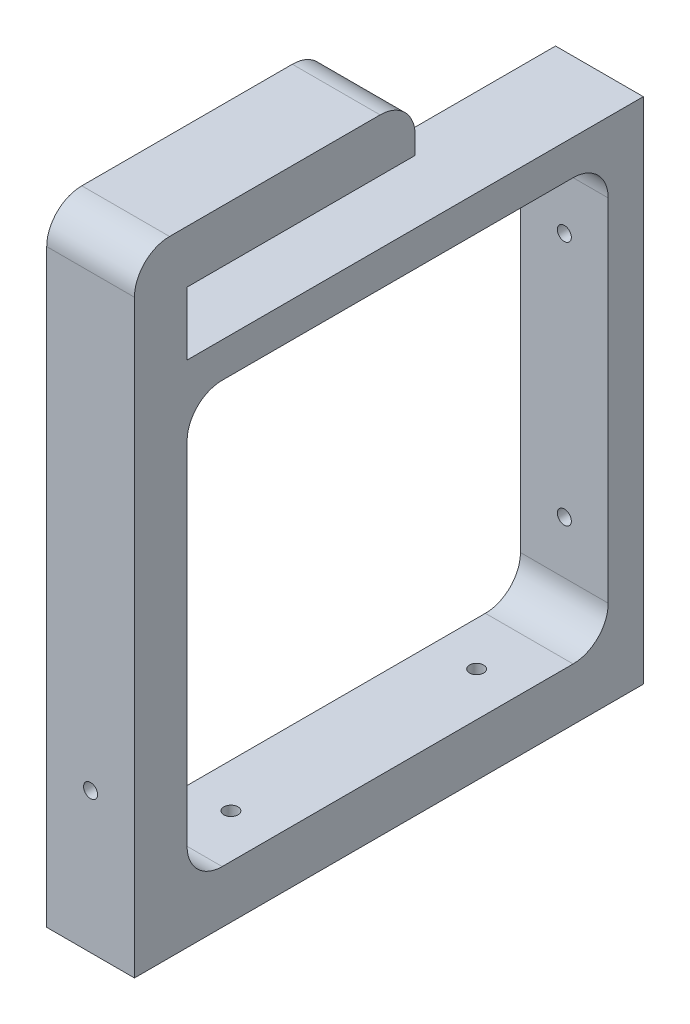
ISO-10303-21;
HEADER;
FILE_DESCRIPTION(('STEP AP214'),'2;1');
FILE_NAME('part.step','',(''),(''),'','','');
FILE_SCHEMA(('AUTOMOTIVE_DESIGN { 1 0 10303 214 1 1 1 1 }'));
ENDSEC;
DATA;
#1=APPLICATION_CONTEXT('core data for automotive mechanical design processes');
#2=APPLICATION_PROTOCOL_DEFINITION('international standard','automotive_design',2000,#1);
#3=PRODUCT_CONTEXT('',#1,'mechanical');
#4=PRODUCT('Part','Part','',(#3));
#5=PRODUCT_RELATED_PRODUCT_CATEGORY('part','',(#4));
#6=PRODUCT_DEFINITION_FORMATION('','',#4);
#7=PRODUCT_DEFINITION_CONTEXT('part definition',#1,'design');
#8=PRODUCT_DEFINITION('design','',#6,#7);
#9=PRODUCT_DEFINITION_SHAPE('','',#8);
#10=(LENGTH_UNIT() NAMED_UNIT(*) SI_UNIT(.MILLI.,.METRE.));
#11=(NAMED_UNIT(*) PLANE_ANGLE_UNIT() SI_UNIT($,.RADIAN.));
#12=(NAMED_UNIT(*) SI_UNIT($,.STERADIAN.) SOLID_ANGLE_UNIT());
#13=UNCERTAINTY_MEASURE_WITH_UNIT(LENGTH_MEASURE(1.E-05),#10,'distance_accuracy_value','');
#14=(GEOMETRIC_REPRESENTATION_CONTEXT(3) GLOBAL_UNCERTAINTY_ASSIGNED_CONTEXT((#13)) GLOBAL_UNIT_ASSIGNED_CONTEXT((#10,
#11,#12)) REPRESENTATION_CONTEXT('',''));
#15=CARTESIAN_POINT('',(0.,0.,0.));
#16=DIRECTION('',(0.,0.,1.));
#17=DIRECTION('',(1.,0.,0.));
#18=AXIS2_PLACEMENT_3D('',#15,#16,#17);
#19=CARTESIAN_POINT('',(25.,0.,0.));
#20=DIRECTION('',(1.,0.,0.));
#21=DIRECTION('',(0.,0.,-1.));
#22=AXIS2_PLACEMENT_3D('',#19,#20,#21);
#23=PLANE('',#22);
#24=DIRECTION('',(0.,1.,0.));
#25=VECTOR('',#24,1.);
#26=CARTESIAN_POINT('',(25.,163.,-80.));
#27=LINE('',#26,#25);
#28=CARTESIAN_POINT('',(25.,163.,-80.));
#29=VERTEX_POINT('',#28);
#30=CARTESIAN_POINT('',(25.,168.,-80.));
#31=VERTEX_POINT('',#30);
#32=EDGE_CURVE('E279',#29,#31,#27,.T.);
#33=ORIENTED_EDGE('',*,*,#32,.T.);
#34=CARTESIAN_POINT('',(25.,168.,-70.));
#35=DIRECTION('',(1.,0.,0.));
#36=DIRECTION('',(0.,0.,-1.));
#37=AXIS2_PLACEMENT_3D('',#34,#35,#36);
#38=CIRCLE('',#37,10.);
#39=CARTESIAN_POINT('',(25.,178.,-70.));
#40=VERTEX_POINT('',#39);
#41=EDGE_CURVE('E201',#31,#40,#38,.T.);
#42=ORIENTED_EDGE('',*,*,#41,.T.);
#43=DIRECTION('',(0.,0.,1.));
#44=VECTOR('',#43,1.);
#45=CARTESIAN_POINT('',(25.,178.,-80.));
#46=LINE('',#45,#44);
#47=CARTESIAN_POINT('',(25.,178.,-9.99999999999999));
#48=VERTEX_POINT('',#47);
#49=EDGE_CURVE('E281',#40,#48,#46,.T.);
#50=ORIENTED_EDGE('',*,*,#49,.T.);
#51=CARTESIAN_POINT('',(25.,168.,-10.));
#52=DIRECTION('',(1.,0.,0.));
#53=DIRECTION('',(0.,0.,-1.));
#54=AXIS2_PLACEMENT_3D('',#51,#52,#53);
#55=CIRCLE('',#54,10.);
#56=CARTESIAN_POINT('',(25.,168.,0.));
#57=VERTEX_POINT('',#56);
#58=EDGE_CURVE('E164',#48,#57,#55,.T.);
#59=ORIENTED_EDGE('',*,*,#58,.T.);
#60=DIRECTION('',(0.,-1.,0.));
#61=VECTOR('',#60,1.);
#62=CARTESIAN_POINT('',(25.,178.,0.));
#63=LINE('',#62,#61);
#64=CARTESIAN_POINT('',(25.,0.,0.));
#65=VERTEX_POINT('',#64);
#66=EDGE_CURVE('E157',#57,#65,#63,.T.);
#67=ORIENTED_EDGE('',*,*,#66,.T.);
#68=DIRECTION('',(0.,0.,-1.));
#69=VECTOR('',#68,1.);
#70=CARTESIAN_POINT('',(25.,0.,0.));
#71=LINE('',#70,#69);
#72=CARTESIAN_POINT('',(25.,0.,-145.));
#73=VERTEX_POINT('',#72);
#74=EDGE_CURVE('E160',#65,#73,#71,.T.);
#75=ORIENTED_EDGE('',*,*,#74,.T.);
#76=DIRECTION('',(0.,1.,0.));
#77=VECTOR('',#76,1.);
#78=CARTESIAN_POINT('',(25.,0.,-145.));
#79=LINE('',#78,#77);
#80=CARTESIAN_POINT('',(25.,145.,-145.));
#81=VERTEX_POINT('',#80);
#82=EDGE_CURVE('E178',#73,#81,#79,.T.);
#83=ORIENTED_EDGE('',*,*,#82,.T.);
#84=DIRECTION('',(0.,0.,1.));
#85=VECTOR('',#84,1.);
#86=CARTESIAN_POINT('',(25.,145.,-145.));
#87=LINE('',#86,#85);
#88=CARTESIAN_POINT('',(25.,145.,-15.));
#89=VERTEX_POINT('',#88);
#90=EDGE_CURVE('E273',#81,#89,#87,.T.);
#91=ORIENTED_EDGE('',*,*,#90,.T.);
#92=DIRECTION('',(0.,1.,0.));
#93=VECTOR('',#92,1.);
#94=CARTESIAN_POINT('',(25.,145.,-15.));
#95=LINE('',#94,#93);
#96=CARTESIAN_POINT('',(25.,163.,-15.));
#97=VERTEX_POINT('',#96);
#98=EDGE_CURVE('E275',#89,#97,#95,.T.);
#99=ORIENTED_EDGE('',*,*,#98,.T.);
#100=DIRECTION('',(0.,0.,-1.));
#101=VECTOR('',#100,1.);
#102=CARTESIAN_POINT('',(25.,163.,-15.));
#103=LINE('',#102,#101);
#104=EDGE_CURVE('E277',#97,#29,#103,.T.);
#105=ORIENTED_EDGE('',*,*,#104,.T.);
#106=EDGE_LOOP('',(#33,#42,#50,#59,#67,#75,#83,#91,#99,#105));
#107=FACE_BOUND('',#106,.T.);
#108=DIRECTION('',(0.,-1.,0.));
#109=VECTOR('',#108,1.);
#110=CARTESIAN_POINT('',(25.,135.,-15.));
#111=LINE('',#110,#109);
#112=CARTESIAN_POINT('',(25.,125.,-15.));
#113=VERTEX_POINT('',#112);
#114=CARTESIAN_POINT('',(25.,25.,-15.));
#115=VERTEX_POINT('',#114);
#116=EDGE_CURVE('E253',#113,#115,#111,.T.);
#117=ORIENTED_EDGE('',*,*,#116,.F.);
#118=CARTESIAN_POINT('',(25.,125.,-25.));
#119=DIRECTION('',(1.,0.,0.));
#120=DIRECTION('',(0.,0.,-1.));
#121=AXIS2_PLACEMENT_3D('',#118,#119,#120);
#122=CIRCLE('',#121,10.);
#123=CARTESIAN_POINT('',(25.,135.,-25.));
#124=VERTEX_POINT('',#123);
#125=EDGE_CURVE('E234',#113,#124,#122,.F.);
#126=ORIENTED_EDGE('',*,*,#125,.T.);
#127=DIRECTION('',(0.,0.,1.));
#128=VECTOR('',#127,1.);
#129=CARTESIAN_POINT('',(25.,135.,-135.));
#130=LINE('',#129,#128);
#131=CARTESIAN_POINT('',(25.,135.,-125.));
#132=VERTEX_POINT('',#131);
#133=EDGE_CURVE('E256',#132,#124,#130,.T.);
#134=ORIENTED_EDGE('',*,*,#133,.F.);
#135=CARTESIAN_POINT('',(25.,125.,-125.));
#136=DIRECTION('',(1.,0.,0.));
#137=DIRECTION('',(0.,0.,-1.));
#138=AXIS2_PLACEMENT_3D('',#135,#136,#137);
#139=CIRCLE('',#138,10.);
#140=CARTESIAN_POINT('',(25.,125.,-135.));
#141=VERTEX_POINT('',#140);
#142=EDGE_CURVE('E230',#132,#141,#139,.F.);
#143=ORIENTED_EDGE('',*,*,#142,.T.);
#144=DIRECTION('',(0.,1.,0.));
#145=VECTOR('',#144,1.);
#146=CARTESIAN_POINT('',(25.,15.,-135.));
#147=LINE('',#146,#145);
#148=CARTESIAN_POINT('',(25.,25.,-135.));
#149=VERTEX_POINT('',#148);
#150=EDGE_CURVE('E258',#149,#141,#147,.T.);
#151=ORIENTED_EDGE('',*,*,#150,.F.);
#152=CARTESIAN_POINT('',(25.,25.,-125.));
#153=DIRECTION('',(1.,0.,0.));
#154=DIRECTION('',(0.,0.,-1.));
#155=AXIS2_PLACEMENT_3D('',#152,#153,#154);
#156=CIRCLE('',#155,10.);
#157=CARTESIAN_POINT('',(25.,15.,-125.));
#158=VERTEX_POINT('',#157);
#159=EDGE_CURVE('E226',#149,#158,#156,.F.);
#160=ORIENTED_EDGE('',*,*,#159,.T.);
#161=DIRECTION('',(0.,0.,-1.));
#162=VECTOR('',#161,1.);
#163=CARTESIAN_POINT('',(25.,15.,-15.));
#164=LINE('',#163,#162);
#165=CARTESIAN_POINT('',(25.,15.,-25.));
#166=VERTEX_POINT('',#165);
#167=EDGE_CURVE('E255',#166,#158,#164,.T.);
#168=ORIENTED_EDGE('',*,*,#167,.F.);
#169=CARTESIAN_POINT('',(25.,25.,-25.));
#170=DIRECTION('',(1.,0.,0.));
#171=DIRECTION('',(0.,0.,-1.));
#172=AXIS2_PLACEMENT_3D('',#169,#170,#171);
#173=CIRCLE('',#172,10.);
#174=EDGE_CURVE('E11',#166,#115,#173,.F.);
#175=ORIENTED_EDGE('',*,*,#174,.T.);
#176=EDGE_LOOP('',(#117,#126,#134,#143,#151,#160,#168,#175));
#177=FACE_BOUND('',#176,.T.);
#178=ADVANCED_FACE('F33',(#107,#177),#23,.T.);
#179=CARTESIAN_POINT('',(0.,0.,0.));
#180=DIRECTION('',(1.,0.,0.));
#181=DIRECTION('',(0.,0.,-1.));
#182=AXIS2_PLACEMENT_3D('',#179,#180,#181);
#183=PLANE('',#182);
#184=DIRECTION('',(0.,0.,1.));
#185=VECTOR('',#184,1.);
#186=CARTESIAN_POINT('',(0.,178.,-80.));
#187=LINE('',#186,#185);
#188=CARTESIAN_POINT('',(0.,178.,-70.));
#189=VERTEX_POINT('',#188);
#190=CARTESIAN_POINT('',(0.,178.,-9.99999999999999));
#191=VERTEX_POINT('',#190);
#192=EDGE_CURVE('E169',#189,#191,#187,.T.);
#193=ORIENTED_EDGE('',*,*,#192,.F.);
#194=CARTESIAN_POINT('',(0.,168.,-70.));
#195=DIRECTION('',(1.,0.,0.));
#196=DIRECTION('',(0.,0.,-1.));
#197=AXIS2_PLACEMENT_3D('',#194,#195,#196);
#198=CIRCLE('',#197,10.);
#199=CARTESIAN_POINT('',(0.,168.,-80.));
#200=VERTEX_POINT('',#199);
#201=EDGE_CURVE('E196',#189,#200,#198,.F.);
#202=ORIENTED_EDGE('',*,*,#201,.T.);
#203=DIRECTION('',(0.,1.,0.));
#204=VECTOR('',#203,1.);
#205=CARTESIAN_POINT('',(0.,163.,-80.));
#206=LINE('',#205,#204);
#207=CARTESIAN_POINT('',(0.,163.,-80.));
#208=VERTEX_POINT('',#207);
#209=EDGE_CURVE('E295',#208,#200,#206,.T.);
#210=ORIENTED_EDGE('',*,*,#209,.F.);
#211=DIRECTION('',(0.,0.,-1.));
#212=VECTOR('',#211,1.);
#213=CARTESIAN_POINT('',(0.,163.,-15.));
#214=LINE('',#213,#212);
#215=CARTESIAN_POINT('',(0.,163.,-15.));
#216=VERTEX_POINT('',#215);
#217=EDGE_CURVE('E293',#216,#208,#214,.T.);
#218=ORIENTED_EDGE('',*,*,#217,.F.);
#219=DIRECTION('',(0.,1.,0.));
#220=VECTOR('',#219,1.);
#221=CARTESIAN_POINT('',(0.,145.,-15.));
#222=LINE('',#221,#220);
#223=CARTESIAN_POINT('',(0.,145.,-15.));
#224=VERTEX_POINT('',#223);
#225=EDGE_CURVE('E291',#224,#216,#222,.T.);
#226=ORIENTED_EDGE('',*,*,#225,.F.);
#227=DIRECTION('',(0.,0.,1.));
#228=VECTOR('',#227,1.);
#229=CARTESIAN_POINT('',(0.,145.,-145.));
#230=LINE('',#229,#228);
#231=CARTESIAN_POINT('',(0.,145.,-145.));
#232=VERTEX_POINT('',#231);
#233=EDGE_CURVE('E289',#232,#224,#230,.T.);
#234=ORIENTED_EDGE('',*,*,#233,.F.);
#235=DIRECTION('',(0.,1.,0.));
#236=VECTOR('',#235,1.);
#237=CARTESIAN_POINT('',(0.,0.,-145.));
#238=LINE('',#237,#236);
#239=CARTESIAN_POINT('',(0.,0.,-145.));
#240=VERTEX_POINT('',#239);
#241=EDGE_CURVE('E287',#240,#232,#238,.T.);
#242=ORIENTED_EDGE('',*,*,#241,.F.);
#243=DIRECTION('',(0.,0.,-1.));
#244=VECTOR('',#243,1.);
#245=CARTESIAN_POINT('',(0.,0.,0.));
#246=LINE('',#245,#244);
#247=CARTESIAN_POINT('',(0.,0.,0.));
#248=VERTEX_POINT('',#247);
#249=EDGE_CURVE('E285',#248,#240,#246,.T.);
#250=ORIENTED_EDGE('',*,*,#249,.F.);
#251=DIRECTION('',(0.,-1.,0.));
#252=VECTOR('',#251,1.);
#253=CARTESIAN_POINT('',(0.,178.,0.));
#254=LINE('',#253,#252);
#255=CARTESIAN_POINT('',(0.,168.,0.));
#256=VERTEX_POINT('',#255);
#257=EDGE_CURVE('E182',#256,#248,#254,.T.);
#258=ORIENTED_EDGE('',*,*,#257,.F.);
#259=CARTESIAN_POINT('',(0.,168.,-10.));
#260=DIRECTION('',(1.,0.,0.));
#261=DIRECTION('',(0.,0.,-1.));
#262=AXIS2_PLACEMENT_3D('',#259,#260,#261);
#263=CIRCLE('',#262,10.);
#264=EDGE_CURVE('E194',#256,#191,#263,.F.);
#265=ORIENTED_EDGE('',*,*,#264,.T.);
#266=EDGE_LOOP('',(#193,#202,#210,#218,#226,#234,#242,#250,#258,#265));
#267=FACE_BOUND('',#266,.T.);
#268=DIRECTION('',(0.,1.,0.));
#269=VECTOR('',#268,1.);
#270=CARTESIAN_POINT('',(0.,15.,-135.));
#271=LINE('',#270,#269);
#272=CARTESIAN_POINT('',(0.,25.,-135.));
#273=VERTEX_POINT('',#272);
#274=CARTESIAN_POINT('',(0.,125.,-135.));
#275=VERTEX_POINT('',#274);
#276=EDGE_CURVE('E250',#273,#275,#271,.T.);
#277=ORIENTED_EDGE('',*,*,#276,.T.);
#278=CARTESIAN_POINT('',(0.,125.,-125.));
#279=DIRECTION('',(1.,0.,0.));
#280=DIRECTION('',(0.,0.,-1.));
#281=AXIS2_PLACEMENT_3D('',#278,#279,#280);
#282=CIRCLE('',#281,10.);
#283=CARTESIAN_POINT('',(0.,135.,-125.));
#284=VERTEX_POINT('',#283);
#285=EDGE_CURVE('E228',#275,#284,#282,.T.);
#286=ORIENTED_EDGE('',*,*,#285,.T.);
#287=DIRECTION('',(0.,0.,1.));
#288=VECTOR('',#287,1.);
#289=CARTESIAN_POINT('',(0.,135.,-135.));
#290=LINE('',#289,#288);
#291=CARTESIAN_POINT('',(0.,135.,-25.));
#292=VERTEX_POINT('',#291);
#293=EDGE_CURVE('E266',#284,#292,#290,.T.);
#294=ORIENTED_EDGE('',*,*,#293,.T.);
#295=CARTESIAN_POINT('',(0.,125.,-25.));
#296=DIRECTION('',(1.,0.,0.));
#297=DIRECTION('',(0.,0.,-1.));
#298=AXIS2_PLACEMENT_3D('',#295,#296,#297);
#299=CIRCLE('',#298,10.);
#300=CARTESIAN_POINT('',(0.,125.,-15.));
#301=VERTEX_POINT('',#300);
#302=EDGE_CURVE('E232',#292,#301,#299,.T.);
#303=ORIENTED_EDGE('',*,*,#302,.T.);
#304=DIRECTION('',(0.,-1.,0.));
#305=VECTOR('',#304,1.);
#306=CARTESIAN_POINT('',(0.,135.,-15.));
#307=LINE('',#306,#305);
#308=CARTESIAN_POINT('',(0.,25.,-15.));
#309=VERTEX_POINT('',#308);
#310=EDGE_CURVE('E242',#301,#309,#307,.T.);
#311=ORIENTED_EDGE('',*,*,#310,.T.);
#312=CARTESIAN_POINT('',(0.,25.,-25.));
#313=DIRECTION('',(1.,0.,0.));
#314=DIRECTION('',(0.,0.,-1.));
#315=AXIS2_PLACEMENT_3D('',#312,#313,#314);
#316=CIRCLE('',#315,10.);
#317=CARTESIAN_POINT('',(0.,15.,-25.));
#318=VERTEX_POINT('',#317);
#319=EDGE_CURVE('E41',#309,#318,#316,.T.);
#320=ORIENTED_EDGE('',*,*,#319,.T.);
#321=DIRECTION('',(0.,0.,-1.));
#322=VECTOR('',#321,1.);
#323=CARTESIAN_POINT('',(0.,15.,-15.));
#324=LINE('',#323,#322);
#325=CARTESIAN_POINT('',(0.,15.,-125.));
#326=VERTEX_POINT('',#325);
#327=EDGE_CURVE('E241',#318,#326,#324,.T.);
#328=ORIENTED_EDGE('',*,*,#327,.T.);
#329=CARTESIAN_POINT('',(0.,25.,-125.));
#330=DIRECTION('',(1.,0.,0.));
#331=DIRECTION('',(0.,0.,-1.));
#332=AXIS2_PLACEMENT_3D('',#329,#330,#331);
#333=CIRCLE('',#332,10.);
#334=EDGE_CURVE('E224',#326,#273,#333,.T.);
#335=ORIENTED_EDGE('',*,*,#334,.T.);
#336=EDGE_LOOP('',(#277,#286,#294,#303,#311,#320,#328,#335));
#337=FACE_BOUND('',#336,.T.);
#338=ADVANCED_FACE('F240',(#267,#337),#183,.F.);
#339=CARTESIAN_POINT('',(25.,178.,0.));
#340=DIRECTION('',(0.,0.,-1.));
#341=DIRECTION('',(0.,1.,0.));
#342=AXIS2_PLACEMENT_3D('',#339,#340,#341);
#343=PLANE('',#342);
#344=CARTESIAN_POINT('',(12.5,40.,0.));
#345=DIRECTION('',(0.,0.,-1.));
#346=DIRECTION('',(0.,1.,0.));
#347=AXIS2_PLACEMENT_3D('',#344,#345,#346);
#348=CIRCLE('',#347,2.);
#349=CARTESIAN_POINT('',(12.5,42.,0.));
#350=VERTEX_POINT('',#349);
#351=EDGE_CURVE('E536',#350,#350,#348,.T.);
#352=ORIENTED_EDGE('',*,*,#351,.T.);
#353=EDGE_LOOP('',(#352));
#354=FACE_BOUND('',#353,.T.);
#355=ORIENTED_EDGE('',*,*,#66,.F.);
#356=DIRECTION('',(-1.,0.,0.));
#357=VECTOR('',#356,1.);
#358=CARTESIAN_POINT('',(25.,168.,0.));
#359=LINE('',#358,#357);
#360=EDGE_CURVE('E203',#57,#256,#359,.T.);
#361=ORIENTED_EDGE('',*,*,#360,.T.);
#362=ORIENTED_EDGE('',*,*,#257,.T.);
#363=DIRECTION('',(-1.,0.,0.));
#364=VECTOR('',#363,1.);
#365=CARTESIAN_POINT('',(25.,0.,0.));
#366=LINE('',#365,#364);
#367=EDGE_CURVE('E174',#65,#248,#366,.T.);
#368=ORIENTED_EDGE('',*,*,#367,.F.);
#369=EDGE_LOOP('',(#355,#361,#362,#368));
#370=FACE_BOUND('',#369,.T.);
#371=ADVANCED_FACE('F180',(#354,#370),#343,.F.);
#372=CARTESIAN_POINT('',(25.,0.,0.));
#373=DIRECTION('',(0.,1.,0.));
#374=DIRECTION('',(0.,0.,1.));
#375=AXIS2_PLACEMENT_3D('',#372,#373,#374);
#376=PLANE('',#375);
#377=CARTESIAN_POINT('',(12.5,0.,-40.));
#378=DIRECTION('',(0.,1.,0.));
#379=DIRECTION('',(0.,0.,1.));
#380=AXIS2_PLACEMENT_3D('',#377,#378,#379);
#381=CIRCLE('',#380,2.);
#382=CARTESIAN_POINT('',(12.5,0.,-38.));
#383=VERTEX_POINT('',#382);
#384=EDGE_CURVE('E269',#383,#383,#381,.T.);
#385=ORIENTED_EDGE('',*,*,#384,.T.);
#386=EDGE_LOOP('',(#385));
#387=FACE_BOUND('',#386,.T.);
#388=CARTESIAN_POINT('',(12.5,0.,-110.));
#389=DIRECTION('',(0.,1.,0.));
#390=DIRECTION('',(0.,0.,1.));
#391=AXIS2_PLACEMENT_3D('',#388,#389,#390);
#392=CIRCLE('',#391,2.);
#393=CARTESIAN_POINT('',(12.5,0.,-108.));
#394=VERTEX_POINT('',#393);
#395=EDGE_CURVE('E559',#394,#394,#392,.T.);
#396=ORIENTED_EDGE('',*,*,#395,.T.);
#397=EDGE_LOOP('',(#396));
#398=FACE_BOUND('',#397,.T.);
#399=ORIENTED_EDGE('',*,*,#249,.T.);
#400=DIRECTION('',(-1.,0.,0.));
#401=VECTOR('',#400,1.);
#402=CARTESIAN_POINT('',(25.,0.,-145.));
#403=LINE('',#402,#401);
#404=EDGE_CURVE('E176',#73,#240,#403,.T.);
#405=ORIENTED_EDGE('',*,*,#404,.F.);
#406=ORIENTED_EDGE('',*,*,#74,.F.);
#407=ORIENTED_EDGE('',*,*,#367,.T.);
#408=EDGE_LOOP('',(#399,#405,#406,#407));
#409=FACE_BOUND('',#408,.T.);
#410=ADVANCED_FACE('F173',(#387,#398,#409),#376,.F.);
#411=CARTESIAN_POINT('',(25.,0.,-145.));
#412=DIRECTION('',(0.,0.,1.));
#413=DIRECTION('',(1.,0.,0.));
#414=AXIS2_PLACEMENT_3D('',#411,#412,#413);
#415=PLANE('',#414);
#416=CARTESIAN_POINT('',(12.5,40.,-145.));
#417=DIRECTION('',(0.,0.,1.));
#418=DIRECTION('',(1.,0.,0.));
#419=AXIS2_PLACEMENT_3D('',#416,#417,#418);
#420=CIRCLE('',#419,2.);
#421=CARTESIAN_POINT('',(14.5,40.,-145.));
#422=VERTEX_POINT('',#421);
#423=EDGE_CURVE('E546',#422,#422,#420,.T.);
#424=ORIENTED_EDGE('',*,*,#423,.T.);
#425=EDGE_LOOP('',(#424));
#426=FACE_BOUND('',#425,.T.);
#427=CARTESIAN_POINT('',(12.5,110.,-145.));
#428=DIRECTION('',(0.,0.,1.));
#429=DIRECTION('',(1.,0.,0.));
#430=AXIS2_PLACEMENT_3D('',#427,#428,#429);
#431=CIRCLE('',#430,2.);
#432=CARTESIAN_POINT('',(14.5,110.,-145.));
#433=VERTEX_POINT('',#432);
#434=EDGE_CURVE('E541',#433,#433,#431,.T.);
#435=ORIENTED_EDGE('',*,*,#434,.T.);
#436=EDGE_LOOP('',(#435));
#437=FACE_BOUND('',#436,.T.);
#438=ORIENTED_EDGE('',*,*,#241,.T.);
#439=DIRECTION('',(-1.,0.,0.));
#440=VECTOR('',#439,1.);
#441=CARTESIAN_POINT('',(25.,145.,-145.));
#442=LINE('',#441,#440);
#443=EDGE_CURVE('E188',#81,#232,#442,.T.);
#444=ORIENTED_EDGE('',*,*,#443,.F.);
#445=ORIENTED_EDGE('',*,*,#82,.F.);
#446=ORIENTED_EDGE('',*,*,#404,.T.);
#447=EDGE_LOOP('',(#438,#444,#445,#446));
#448=FACE_BOUND('',#447,.T.);
#449=ADVANCED_FACE('F331',(#426,#437,#448),#415,.F.);
#450=CARTESIAN_POINT('',(25.,145.,-145.));
#451=DIRECTION('',(0.,-1.,0.));
#452=DIRECTION('',(0.,0.,-1.));
#453=AXIS2_PLACEMENT_3D('',#450,#451,#452);
#454=PLANE('',#453);
#455=ORIENTED_EDGE('',*,*,#233,.T.);
#456=DIRECTION('',(-1.,0.,0.));
#457=VECTOR('',#456,1.);
#458=CARTESIAN_POINT('',(25.,145.,-15.));
#459=LINE('',#458,#457);
#460=EDGE_CURVE('E305',#89,#224,#459,.T.);
#461=ORIENTED_EDGE('',*,*,#460,.F.);
#462=ORIENTED_EDGE('',*,*,#90,.F.);
#463=ORIENTED_EDGE('',*,*,#443,.T.);
#464=EDGE_LOOP('',(#455,#461,#462,#463));
#465=FACE_BOUND('',#464,.T.);
#466=ADVANCED_FACE('F312',(#465),#454,.F.);
#467=CARTESIAN_POINT('',(25.,145.,-15.));
#468=DIRECTION('',(0.,0.,1.));
#469=DIRECTION('',(0.,-1.,0.));
#470=AXIS2_PLACEMENT_3D('',#467,#468,#469);
#471=PLANE('',#470);
#472=ORIENTED_EDGE('',*,*,#225,.T.);
#473=DIRECTION('',(-1.,0.,0.));
#474=VECTOR('',#473,1.);
#475=CARTESIAN_POINT('',(25.,163.,-15.));
#476=LINE('',#475,#474);
#477=EDGE_CURVE('E302',#97,#216,#476,.T.);
#478=ORIENTED_EDGE('',*,*,#477,.F.);
#479=ORIENTED_EDGE('',*,*,#98,.F.);
#480=ORIENTED_EDGE('',*,*,#460,.T.);
#481=EDGE_LOOP('',(#472,#478,#479,#480));
#482=FACE_BOUND('',#481,.T.);
#483=ADVANCED_FACE('F323',(#482),#471,.F.);
#484=CARTESIAN_POINT('',(25.,163.,-15.));
#485=DIRECTION('',(0.,1.,0.));
#486=DIRECTION('',(0.,0.,1.));
#487=AXIS2_PLACEMENT_3D('',#484,#485,#486);
#488=PLANE('',#487);
#489=ORIENTED_EDGE('',*,*,#217,.T.);
#490=DIRECTION('',(-1.,0.,0.));
#491=VECTOR('',#490,1.);
#492=CARTESIAN_POINT('',(25.,163.,-80.));
#493=LINE('',#492,#491);
#494=EDGE_CURVE('E283',#29,#208,#493,.T.);
#495=ORIENTED_EDGE('',*,*,#494,.F.);
#496=ORIENTED_EDGE('',*,*,#104,.F.);
#497=ORIENTED_EDGE('',*,*,#477,.T.);
#498=EDGE_LOOP('',(#489,#495,#496,#497));
#499=FACE_BOUND('',#498,.T.);
#500=ADVANCED_FACE('F327',(#499),#488,.F.);
#501=CARTESIAN_POINT('',(25.,163.,-80.));
#502=DIRECTION('',(0.,0.,1.));
#503=DIRECTION('',(1.,0.,0.));
#504=AXIS2_PLACEMENT_3D('',#501,#502,#503);
#505=PLANE('',#504);
#506=ORIENTED_EDGE('',*,*,#209,.T.);
#507=DIRECTION('',(-1.,0.,0.));
#508=VECTOR('',#507,1.);
#509=CARTESIAN_POINT('',(25.,168.,-80.));
#510=LINE('',#509,#508);
#511=EDGE_CURVE('E198',#200,#31,#510,.F.);
#512=ORIENTED_EDGE('',*,*,#511,.T.);
#513=ORIENTED_EDGE('',*,*,#32,.F.);
#514=ORIENTED_EDGE('',*,*,#494,.T.);
#515=EDGE_LOOP('',(#506,#512,#513,#514));
#516=FACE_BOUND('',#515,.T.);
#517=ADVANCED_FACE('F358',(#516),#505,.F.);
#518=CARTESIAN_POINT('',(25.,178.,-80.));
#519=DIRECTION('',(0.,-1.,0.));
#520=DIRECTION('',(0.,0.,-1.));
#521=AXIS2_PLACEMENT_3D('',#518,#519,#520);
#522=PLANE('',#521);
#523=ORIENTED_EDGE('',*,*,#49,.F.);
#524=DIRECTION('',(-1.,0.,0.));
#525=VECTOR('',#524,1.);
#526=CARTESIAN_POINT('',(25.,178.,-70.));
#527=LINE('',#526,#525);
#528=EDGE_CURVE('E186',#40,#189,#527,.T.);
#529=ORIENTED_EDGE('',*,*,#528,.T.);
#530=ORIENTED_EDGE('',*,*,#192,.T.);
#531=DIRECTION('',(-1.,0.,0.));
#532=VECTOR('',#531,1.);
#533=CARTESIAN_POINT('',(25.,178.,-9.99999999999999));
#534=LINE('',#533,#532);
#535=EDGE_CURVE('E184',#191,#48,#534,.F.);
#536=ORIENTED_EDGE('',*,*,#535,.T.);
#537=EDGE_LOOP('',(#523,#529,#530,#536));
#538=FACE_BOUND('',#537,.T.);
#539=ADVANCED_FACE('F355',(#538),#522,.F.);
#540=CARTESIAN_POINT('',(25.,135.,-135.));
#541=DIRECTION('',(0.,-1.,0.));
#542=DIRECTION('',(0.,0.,-1.));
#543=AXIS2_PLACEMENT_3D('',#540,#541,#542);
#544=PLANE('',#543);
#545=ORIENTED_EDGE('',*,*,#293,.F.);
#546=DIRECTION('',(-1.,0.,0.));
#547=VECTOR('',#546,1.);
#548=CARTESIAN_POINT('',(25.,135.,-125.));
#549=LINE('',#548,#547);
#550=EDGE_CURVE('E218',#284,#132,#549,.F.);
#551=ORIENTED_EDGE('',*,*,#550,.T.);
#552=ORIENTED_EDGE('',*,*,#133,.T.);
#553=DIRECTION('',(-1.,0.,0.));
#554=VECTOR('',#553,1.);
#555=CARTESIAN_POINT('',(0.,135.,-25.));
#556=LINE('',#555,#554);
#557=EDGE_CURVE('E215',#124,#292,#556,.T.);
#558=ORIENTED_EDGE('',*,*,#557,.T.);
#559=EDGE_LOOP('',(#545,#551,#552,#558));
#560=FACE_BOUND('',#559,.T.);
#561=ADVANCED_FACE('F352',(#560),#544,.T.);
#562=CARTESIAN_POINT('',(25.,135.,-15.));
#563=DIRECTION('',(0.,0.,-1.));
#564=DIRECTION('',(0.,1.,0.));
#565=AXIS2_PLACEMENT_3D('',#562,#563,#564);
#566=PLANE('',#565);
#567=CARTESIAN_POINT('',(12.5,40.,-15.));
#568=DIRECTION('',(0.,0.,-1.));
#569=DIRECTION('',(0.,1.,0.));
#570=AXIS2_PLACEMENT_3D('',#567,#568,#569);
#571=CIRCLE('',#570,2.);
#572=CARTESIAN_POINT('',(12.5,42.,-15.));
#573=VERTEX_POINT('',#572);
#574=EDGE_CURVE('E538',#573,#573,#571,.T.);
#575=ORIENTED_EDGE('',*,*,#574,.F.);
#576=EDGE_LOOP('',(#575));
#577=FACE_BOUND('',#576,.T.);
#578=ORIENTED_EDGE('',*,*,#310,.F.);
#579=DIRECTION('',(-1.,0.,0.));
#580=VECTOR('',#579,1.);
#581=CARTESIAN_POINT('',(25.,125.,-15.));
#582=LINE('',#581,#580);
#583=EDGE_CURVE('E53',#301,#113,#582,.F.);
#584=ORIENTED_EDGE('',*,*,#583,.T.);
#585=ORIENTED_EDGE('',*,*,#116,.T.);
#586=DIRECTION('',(-1.,0.,0.));
#587=VECTOR('',#586,1.);
#588=CARTESIAN_POINT('',(0.,25.,-15.));
#589=LINE('',#588,#587);
#590=EDGE_CURVE('E220',#115,#309,#589,.T.);
#591=ORIENTED_EDGE('',*,*,#590,.T.);
#592=EDGE_LOOP('',(#578,#584,#585,#591));
#593=FACE_BOUND('',#592,.T.);
#594=ADVANCED_FACE('F252',(#577,#593),#566,.T.);
#595=CARTESIAN_POINT('',(25.,15.,-15.));
#596=DIRECTION('',(0.,1.,0.));
#597=DIRECTION('',(0.,0.,1.));
#598=AXIS2_PLACEMENT_3D('',#595,#596,#597);
#599=PLANE('',#598);
#600=CARTESIAN_POINT('',(12.5,15.,-40.));
#601=DIRECTION('',(0.,1.,0.));
#602=DIRECTION('',(0.,0.,1.));
#603=AXIS2_PLACEMENT_3D('',#600,#601,#602);
#604=CIRCLE('',#603,2.);
#605=CARTESIAN_POINT('',(12.5,15.,-38.));
#606=VERTEX_POINT('',#605);
#607=EDGE_CURVE('E556',#606,#606,#604,.T.);
#608=ORIENTED_EDGE('',*,*,#607,.F.);
#609=EDGE_LOOP('',(#608));
#610=FACE_BOUND('',#609,.T.);
#611=CARTESIAN_POINT('',(12.5,15.,-110.));
#612=DIRECTION('',(0.,1.,0.));
#613=DIRECTION('',(0.,0.,1.));
#614=AXIS2_PLACEMENT_3D('',#611,#612,#613);
#615=CIRCLE('',#614,2.);
#616=CARTESIAN_POINT('',(12.5,15.,-108.));
#617=VERTEX_POINT('',#616);
#618=EDGE_CURVE('E548',#617,#617,#615,.T.);
#619=ORIENTED_EDGE('',*,*,#618,.F.);
#620=EDGE_LOOP('',(#619));
#621=FACE_BOUND('',#620,.T.);
#622=ORIENTED_EDGE('',*,*,#167,.T.);
#623=DIRECTION('',(-1.,0.,0.));
#624=VECTOR('',#623,1.);
#625=CARTESIAN_POINT('',(0.,15.,-125.));
#626=LINE('',#625,#624);
#627=EDGE_CURVE('E207',#158,#326,#626,.T.);
#628=ORIENTED_EDGE('',*,*,#627,.T.);
#629=ORIENTED_EDGE('',*,*,#327,.F.);
#630=DIRECTION('',(-1.,0.,0.));
#631=VECTOR('',#630,1.);
#632=CARTESIAN_POINT('',(25.,15.,-25.));
#633=LINE('',#632,#631);
#634=EDGE_CURVE('E205',#318,#166,#633,.F.);
#635=ORIENTED_EDGE('',*,*,#634,.T.);
#636=EDGE_LOOP('',(#622,#628,#629,#635));
#637=FACE_BOUND('',#636,.T.);
#638=ADVANCED_FACE('F248',(#610,#621,#637),#599,.T.);
#639=CARTESIAN_POINT('',(25.,15.,-135.));
#640=DIRECTION('',(0.,0.,1.));
#641=DIRECTION('',(1.,0.,0.));
#642=AXIS2_PLACEMENT_3D('',#639,#640,#641);
#643=PLANE('',#642);
#644=CARTESIAN_POINT('',(12.5,40.,-135.));
#645=DIRECTION('',(0.,0.,1.));
#646=DIRECTION('',(1.,0.,0.));
#647=AXIS2_PLACEMENT_3D('',#644,#645,#646);
#648=CIRCLE('',#647,2.);
#649=CARTESIAN_POINT('',(14.5,40.,-135.));
#650=VERTEX_POINT('',#649);
#651=EDGE_CURVE('E549',#650,#650,#648,.T.);
#652=ORIENTED_EDGE('',*,*,#651,.F.);
#653=EDGE_LOOP('',(#652));
#654=FACE_BOUND('',#653,.T.);
#655=CARTESIAN_POINT('',(12.5,110.,-135.));
#656=DIRECTION('',(0.,0.,1.));
#657=DIRECTION('',(1.,0.,0.));
#658=AXIS2_PLACEMENT_3D('',#655,#656,#657);
#659=CIRCLE('',#658,2.);
#660=CARTESIAN_POINT('',(14.5,110.,-135.));
#661=VERTEX_POINT('',#660);
#662=EDGE_CURVE('E537',#661,#661,#659,.T.);
#663=ORIENTED_EDGE('',*,*,#662,.F.);
#664=EDGE_LOOP('',(#663));
#665=FACE_BOUND('',#664,.T.);
#666=ORIENTED_EDGE('',*,*,#276,.F.);
#667=DIRECTION('',(-1.,0.,0.));
#668=VECTOR('',#667,1.);
#669=CARTESIAN_POINT('',(25.,25.,-135.));
#670=LINE('',#669,#668);
#671=EDGE_CURVE('E213',#273,#149,#670,.F.);
#672=ORIENTED_EDGE('',*,*,#671,.T.);
#673=ORIENTED_EDGE('',*,*,#150,.T.);
#674=DIRECTION('',(-1.,0.,0.));
#675=VECTOR('',#674,1.);
#676=CARTESIAN_POINT('',(0.,125.,-135.));
#677=LINE('',#676,#675);
#678=EDGE_CURVE('E210',#141,#275,#677,.T.);
#679=ORIENTED_EDGE('',*,*,#678,.T.);
#680=EDGE_LOOP('',(#666,#672,#673,#679));
#681=FACE_BOUND('',#680,.T.);
#682=ADVANCED_FACE('F412',(#654,#665,#681),#643,.T.);
#683=CARTESIAN_POINT('',(12.5,0.,-110.));
#684=DIRECTION('',(0.,1.,0.));
#685=DIRECTION('',(0.,0.,1.));
#686=AXIS2_PLACEMENT_3D('',#683,#684,#685);
#687=CYLINDRICAL_SURFACE('',#686,2.);
#688=ORIENTED_EDGE('',*,*,#395,.F.);
#689=EDGE_LOOP('',(#688));
#690=FACE_BOUND('',#689,.T.);
#691=ORIENTED_EDGE('',*,*,#618,.T.);
#692=EDGE_LOOP('',(#691));
#693=FACE_BOUND('',#692,.T.);
#694=ADVANCED_FACE('F422',(#690,#693),#687,.F.);
#695=CARTESIAN_POINT('',(12.5,0.,-40.));
#696=DIRECTION('',(0.,1.,0.));
#697=DIRECTION('',(0.,0.,1.));
#698=AXIS2_PLACEMENT_3D('',#695,#696,#697);
#699=CYLINDRICAL_SURFACE('',#698,2.);
#700=ORIENTED_EDGE('',*,*,#384,.F.);
#701=EDGE_LOOP('',(#700));
#702=FACE_BOUND('',#701,.T.);
#703=ORIENTED_EDGE('',*,*,#607,.T.);
#704=EDGE_LOOP('',(#703));
#705=FACE_BOUND('',#704,.T.);
#706=ADVANCED_FACE('F433',(#702,#705),#699,.F.);
#707=CARTESIAN_POINT('',(12.5,110.,-145.));
#708=DIRECTION('',(0.,0.,1.));
#709=DIRECTION('',(1.,0.,0.));
#710=AXIS2_PLACEMENT_3D('',#707,#708,#709);
#711=CYLINDRICAL_SURFACE('',#710,2.);
#712=ORIENTED_EDGE('',*,*,#434,.F.);
#713=EDGE_LOOP('',(#712));
#714=FACE_BOUND('',#713,.T.);
#715=ORIENTED_EDGE('',*,*,#662,.T.);
#716=EDGE_LOOP('',(#715));
#717=FACE_BOUND('',#716,.T.);
#718=ADVANCED_FACE('F440',(#714,#717),#711,.F.);
#719=CARTESIAN_POINT('',(12.5,40.,-145.));
#720=DIRECTION('',(0.,0.,1.));
#721=DIRECTION('',(1.,0.,0.));
#722=AXIS2_PLACEMENT_3D('',#719,#720,#721);
#723=CYLINDRICAL_SURFACE('',#722,2.);
#724=ORIENTED_EDGE('',*,*,#423,.F.);
#725=EDGE_LOOP('',(#724));
#726=FACE_BOUND('',#725,.T.);
#727=ORIENTED_EDGE('',*,*,#651,.T.);
#728=EDGE_LOOP('',(#727));
#729=FACE_BOUND('',#728,.T.);
#730=ADVANCED_FACE('F448',(#726,#729),#723,.F.);
#731=CARTESIAN_POINT('',(12.5,40.,0.));
#732=DIRECTION('',(0.,0.,-1.));
#733=DIRECTION('',(0.,1.,0.));
#734=AXIS2_PLACEMENT_3D('',#731,#732,#733);
#735=CYLINDRICAL_SURFACE('',#734,2.);
#736=ORIENTED_EDGE('',*,*,#351,.F.);
#737=EDGE_LOOP('',(#736));
#738=FACE_BOUND('',#737,.T.);
#739=ORIENTED_EDGE('',*,*,#574,.T.);
#740=EDGE_LOOP('',(#739));
#741=FACE_BOUND('',#740,.T.);
#742=ADVANCED_FACE('F456',(#738,#741),#735,.F.);
#743=CARTESIAN_POINT('',(25.,168.,-70.));
#744=DIRECTION('',(-1.,0.,0.));
#745=DIRECTION('',(0.,0.,1.));
#746=AXIS2_PLACEMENT_3D('',#743,#744,#745);
#747=CYLINDRICAL_SURFACE('',#746,10.);
#748=ORIENTED_EDGE('',*,*,#41,.F.);
#749=ORIENTED_EDGE('',*,*,#511,.F.);
#750=ORIENTED_EDGE('',*,*,#201,.F.);
#751=ORIENTED_EDGE('',*,*,#528,.F.);
#752=EDGE_LOOP('',(#748,#749,#750,#751));
#753=FACE_BOUND('',#752,.T.);
#754=ADVANCED_FACE('F464',(#753),#747,.T.);
#755=CARTESIAN_POINT('',(25.,168.,-10.));
#756=DIRECTION('',(-1.,0.,0.));
#757=DIRECTION('',(0.,0.,1.));
#758=AXIS2_PLACEMENT_3D('',#755,#756,#757);
#759=CYLINDRICAL_SURFACE('',#758,10.);
#760=ORIENTED_EDGE('',*,*,#58,.F.);
#761=ORIENTED_EDGE('',*,*,#535,.F.);
#762=ORIENTED_EDGE('',*,*,#264,.F.);
#763=ORIENTED_EDGE('',*,*,#360,.F.);
#764=EDGE_LOOP('',(#760,#761,#762,#763));
#765=FACE_BOUND('',#764,.T.);
#766=ADVANCED_FACE('F471',(#765),#759,.T.);
#767=CARTESIAN_POINT('',(25.,25.,-125.));
#768=DIRECTION('',(1.,0.,0.));
#769=DIRECTION('',(0.,0.,-1.));
#770=AXIS2_PLACEMENT_3D('',#767,#768,#769);
#771=CYLINDRICAL_SURFACE('',#770,10.);
#772=ORIENTED_EDGE('',*,*,#159,.F.);
#773=ORIENTED_EDGE('',*,*,#671,.F.);
#774=ORIENTED_EDGE('',*,*,#334,.F.);
#775=ORIENTED_EDGE('',*,*,#627,.F.);
#776=EDGE_LOOP('',(#772,#773,#774,#775));
#777=FACE_BOUND('',#776,.T.);
#778=ADVANCED_FACE('F478',(#777),#771,.F.);
#779=CARTESIAN_POINT('',(25.,125.,-125.));
#780=DIRECTION('',(1.,0.,0.));
#781=DIRECTION('',(0.,0.,-1.));
#782=AXIS2_PLACEMENT_3D('',#779,#780,#781);
#783=CYLINDRICAL_SURFACE('',#782,10.);
#784=ORIENTED_EDGE('',*,*,#142,.F.);
#785=ORIENTED_EDGE('',*,*,#550,.F.);
#786=ORIENTED_EDGE('',*,*,#285,.F.);
#787=ORIENTED_EDGE('',*,*,#678,.F.);
#788=EDGE_LOOP('',(#784,#785,#786,#787));
#789=FACE_BOUND('',#788,.T.);
#790=ADVANCED_FACE('F485',(#789),#783,.F.);
#791=CARTESIAN_POINT('',(25.,125.,-25.));
#792=DIRECTION('',(1.,0.,0.));
#793=DIRECTION('',(0.,0.,-1.));
#794=AXIS2_PLACEMENT_3D('',#791,#792,#793);
#795=CYLINDRICAL_SURFACE('',#794,10.);
#796=ORIENTED_EDGE('',*,*,#125,.F.);
#797=ORIENTED_EDGE('',*,*,#583,.F.);
#798=ORIENTED_EDGE('',*,*,#302,.F.);
#799=ORIENTED_EDGE('',*,*,#557,.F.);
#800=EDGE_LOOP('',(#796,#797,#798,#799));
#801=FACE_BOUND('',#800,.T.);
#802=ADVANCED_FACE('F493',(#801),#795,.F.);
#803=CARTESIAN_POINT('',(25.,25.,-25.));
#804=DIRECTION('',(1.,0.,0.));
#805=DIRECTION('',(0.,0.,-1.));
#806=AXIS2_PLACEMENT_3D('',#803,#804,#805);
#807=CYLINDRICAL_SURFACE('',#806,10.);
#808=ORIENTED_EDGE('',*,*,#174,.F.);
#809=ORIENTED_EDGE('',*,*,#634,.F.);
#810=ORIENTED_EDGE('',*,*,#319,.F.);
#811=ORIENTED_EDGE('',*,*,#590,.F.);
#812=EDGE_LOOP('',(#808,#809,#810,#811));
#813=FACE_BOUND('',#812,.T.);
#814=ADVANCED_FACE('F35',(#813),#807,.F.);
#815=CLOSED_SHELL('',(#178,#338,#371,#410,#449,#466,#483,#500,#517,#539,#561,#594,#638,#682,
#694,#706,#718,#730,#742,#754,#766,#778,#790,#802,#814));
#816=MANIFOLD_SOLID_BREP('B2',#815);
#817=ADVANCED_BREP_SHAPE_REPRESENTATION('',(#18,#816),#14);
#818=SHAPE_DEFINITION_REPRESENTATION(#9,#817);
ENDSEC;
END-ISO-10303-21;
